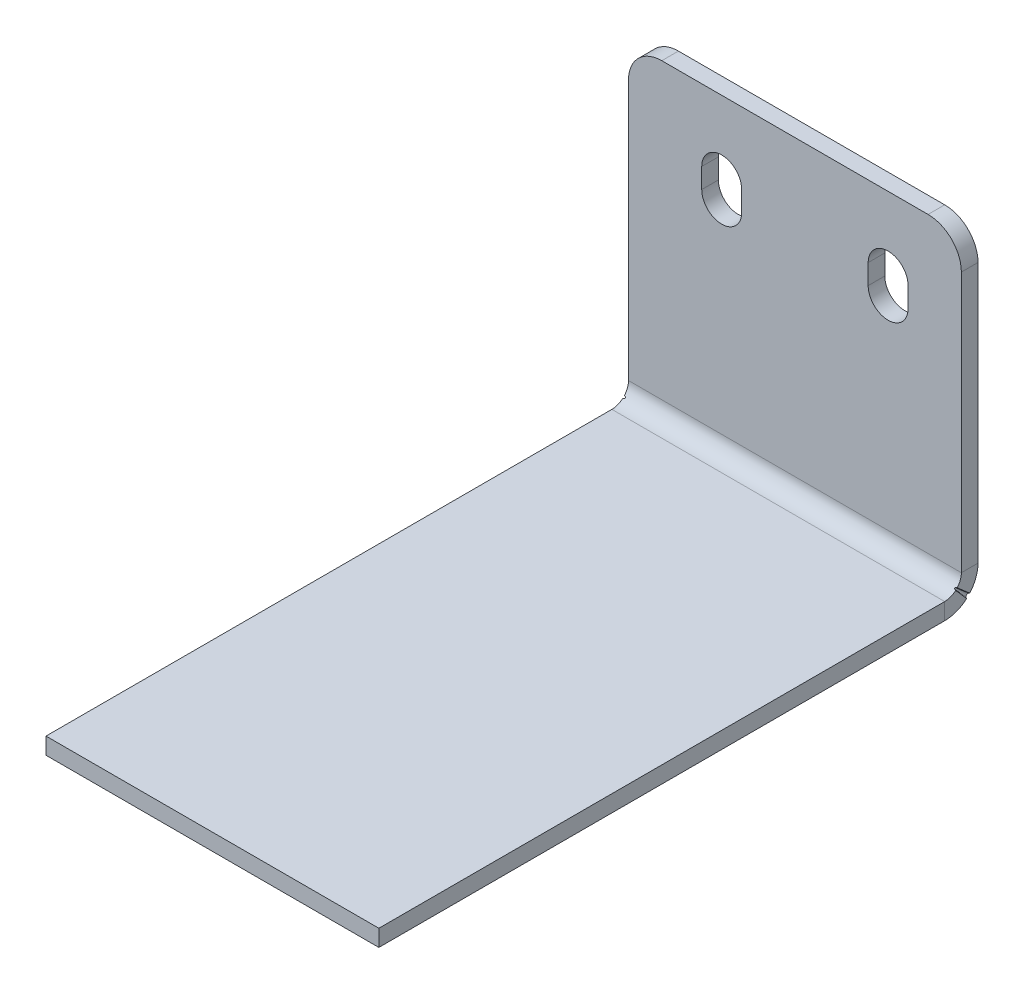
ISO-10303-21;
HEADER;
FILE_DESCRIPTION(('STEP AP214'),'2;1');
FILE_NAME('part.step','',(''),(''),'','','');
FILE_SCHEMA(('AUTOMOTIVE_DESIGN { 1 0 10303 214 1 1 1 1 }'));
ENDSEC;
DATA;
#1=APPLICATION_CONTEXT('core data for automotive mechanical design processes');
#2=APPLICATION_PROTOCOL_DEFINITION('international standard','automotive_design',2000,#1);
#3=PRODUCT_CONTEXT('',#1,'mechanical');
#4=PRODUCT('Part','Part','',(#3));
#5=PRODUCT_RELATED_PRODUCT_CATEGORY('part','',(#4));
#6=PRODUCT_DEFINITION_FORMATION('','',#4);
#7=PRODUCT_DEFINITION_CONTEXT('part definition',#1,'design');
#8=PRODUCT_DEFINITION('design','',#6,#7);
#9=PRODUCT_DEFINITION_SHAPE('','',#8);
#10=(LENGTH_UNIT() NAMED_UNIT(*) SI_UNIT(.MILLI.,.METRE.));
#11=(NAMED_UNIT(*) PLANE_ANGLE_UNIT() SI_UNIT($,.RADIAN.));
#12=(NAMED_UNIT(*) SI_UNIT($,.STERADIAN.) SOLID_ANGLE_UNIT());
#13=UNCERTAINTY_MEASURE_WITH_UNIT(LENGTH_MEASURE(1.E-05),#10,'distance_accuracy_value','');
#14=(GEOMETRIC_REPRESENTATION_CONTEXT(3) GLOBAL_UNCERTAINTY_ASSIGNED_CONTEXT((#13)) GLOBAL_UNIT_ASSIGNED_CONTEXT((#10,
#11,#12)) REPRESENTATION_CONTEXT('',''));
#15=CARTESIAN_POINT('',(0.,0.,0.));
#16=DIRECTION('',(0.,0.,1.));
#17=DIRECTION('',(1.,0.,0.));
#18=AXIS2_PLACEMENT_3D('',#15,#16,#17);
#19=CARTESIAN_POINT('',(50.,41.7804862254809,-0.890486225480803));
#20=DIRECTION('',(0.,1.,0.));
#21=DIRECTION('',(1.,0.,0.));
#22=AXIS2_PLACEMENT_3D('',#19,#20,#21);
#23=PLANE('',#22);
#24=DIRECTION('',(0.,0.,1.));
#25=VECTOR('',#24,1.);
#26=CARTESIAN_POINT('',(-50.,41.7804862254809,-0.390486225480803));
#27=LINE('',#26,#25);
#28=CARTESIAN_POINT('',(-50.,41.7804862254809,5.00000000000005));
#29=VERTEX_POINT('',#28);
#30=CARTESIAN_POINT('',(-50.,41.7804862254815,174.999513774519));
#31=VERTEX_POINT('',#30);
#32=EDGE_CURVE('E61',#29,#31,#27,.T.);
#33=ORIENTED_EDGE('',*,*,#32,.F.);
#34=DIRECTION('',(1.,0.,0.));
#35=VECTOR('',#34,1.);
#36=CARTESIAN_POINT('',(50.,41.7804862254809,5.00000000000004));
#37=LINE('',#36,#35);
#38=CARTESIAN_POINT('',(50.,41.7804862254809,5.00000000000005));
#39=VERTEX_POINT('',#38);
#40=EDGE_CURVE('E101',#29,#39,#37,.T.);
#41=ORIENTED_EDGE('',*,*,#40,.T.);
#42=DIRECTION('',(0.,0.,-1.));
#43=VECTOR('',#42,1.);
#44=CARTESIAN_POINT('',(50.,41.7804862254809,-0.390486225480803));
#45=LINE('',#44,#43);
#46=CARTESIAN_POINT('',(50.0000000000001,41.7804862254815,174.999513774519));
#47=VERTEX_POINT('',#46);
#48=EDGE_CURVE('E121',#47,#39,#45,.T.);
#49=ORIENTED_EDGE('',*,*,#48,.F.);
#50=DIRECTION('',(1.,0.,0.));
#51=VECTOR('',#50,1.);
#52=CARTESIAN_POINT('',(50.0000000000001,41.7804862254815,174.999513774519));
#53=LINE('',#52,#51);
#54=EDGE_CURVE('E100',#31,#47,#53,.T.);
#55=ORIENTED_EDGE('',*,*,#54,.F.);
#56=EDGE_LOOP('',(#33,#41,#49,#55));
#57=FACE_BOUND('',#56,.T.);
#58=ADVANCED_FACE('F57',(#57),#23,.F.);
#59=CARTESIAN_POINT('',(-50.,41.7804862254809,-0.390486225480803));
#60=DIRECTION('',(-1.,0.,0.));
#61=DIRECTION('',(0.,0.,1.));
#62=AXIS2_PLACEMENT_3D('',#59,#60,#61);
#63=PLANE('',#62);
#64=DIRECTION('',(0.,1.,0.));
#65=VECTOR('',#64,1.);
#66=CARTESIAN_POINT('',(-50.,41.7804862254808,5.00000000000004));
#67=LINE('',#66,#65);
#68=CARTESIAN_POINT('',(-49.9999999999999,46.7804862254809,5.00000000000003));
#69=VERTEX_POINT('',#68);
#70=EDGE_CURVE('E124',#29,#69,#67,.T.);
#71=ORIENTED_EDGE('',*,*,#70,.F.);
#72=ORIENTED_EDGE('',*,*,#32,.T.);
#73=DIRECTION('',(0.,1.,0.));
#74=VECTOR('',#73,1.);
#75=CARTESIAN_POINT('',(-50.,41.7804862254815,174.999513774519));
#76=LINE('',#75,#74);
#77=CARTESIAN_POINT('',(-50.,46.7804862254815,174.999513774519));
#78=VERTEX_POINT('',#77);
#79=EDGE_CURVE('E102',#31,#78,#76,.T.);
#80=ORIENTED_EDGE('',*,*,#79,.T.);
#81=DIRECTION('',(0.,0.,1.));
#82=VECTOR('',#81,1.);
#83=CARTESIAN_POINT('',(-50.,46.7804862254809,-0.390486225480824));
#84=LINE('',#83,#82);
#85=EDGE_CURVE('E113',#69,#78,#84,.T.);
#86=ORIENTED_EDGE('',*,*,#85,.F.);
#87=EDGE_LOOP('',(#71,#72,#80,#86));
#88=FACE_BOUND('',#87,.T.);
#89=ADVANCED_FACE('F132',(#88),#63,.T.);
#90=CARTESIAN_POINT('',(50.,41.7804862254809,-0.390486225480803));
#91=DIRECTION('',(1.,0.,0.));
#92=DIRECTION('',(0.,0.,-1.));
#93=AXIS2_PLACEMENT_3D('',#90,#91,#92);
#94=PLANE('',#93);
#95=DIRECTION('',(0.,-1.,0.));
#96=VECTOR('',#95,1.);
#97=CARTESIAN_POINT('',(50.,41.7804862254809,5.00000000000004));
#98=LINE('',#97,#96);
#99=CARTESIAN_POINT('',(50.0000000000001,46.7804862254809,5.00000000000003));
#100=VERTEX_POINT('',#99);
#101=EDGE_CURVE('E12',#100,#39,#98,.T.);
#102=ORIENTED_EDGE('',*,*,#101,.F.);
#103=DIRECTION('',(0.,0.,-1.));
#104=VECTOR('',#103,1.);
#105=CARTESIAN_POINT('',(50.,46.7804862254809,-0.390486225480824));
#106=LINE('',#105,#104);
#107=CARTESIAN_POINT('',(50.0000000000001,46.7804862254815,174.999513774519));
#108=VERTEX_POINT('',#107);
#109=EDGE_CURVE('E106',#108,#100,#106,.T.);
#110=ORIENTED_EDGE('',*,*,#109,.F.);
#111=DIRECTION('',(0.,1.,0.));
#112=VECTOR('',#111,1.);
#113=CARTESIAN_POINT('',(50.0000000000001,41.7804862254815,174.999513774519));
#114=LINE('',#113,#112);
#115=EDGE_CURVE('E82',#47,#108,#114,.T.);
#116=ORIENTED_EDGE('',*,*,#115,.F.);
#117=ORIENTED_EDGE('',*,*,#48,.T.);
#118=EDGE_LOOP('',(#102,#110,#116,#117));
#119=FACE_BOUND('',#118,.T.);
#120=ADVANCED_FACE('F59',(#119),#94,.T.);
#121=CARTESIAN_POINT('',(50.0000000000001,41.7804862254815,174.999513774519));
#122=DIRECTION('',(0.,0.,1.));
#123=DIRECTION('',(0.,-1.,0.));
#124=AXIS2_PLACEMENT_3D('',#121,#122,#123);
#125=PLANE('',#124);
#126=DIRECTION('',(1.,0.,0.));
#127=VECTOR('',#126,1.);
#128=CARTESIAN_POINT('',(50.0000000000001,46.7804862254815,174.999513774519));
#129=LINE('',#128,#127);
#130=EDGE_CURVE('E98',#78,#108,#129,.T.);
#131=ORIENTED_EDGE('',*,*,#130,.F.);
#132=ORIENTED_EDGE('',*,*,#79,.F.);
#133=ORIENTED_EDGE('',*,*,#54,.T.);
#134=ORIENTED_EDGE('',*,*,#115,.T.);
#135=EDGE_LOOP('',(#131,#132,#133,#134));
#136=FACE_BOUND('',#135,.T.);
#137=ADVANCED_FACE('F95',(#136),#125,.T.);
#138=CARTESIAN_POINT('',(50.,46.7804862254809,-0.890486225480824));
#139=DIRECTION('',(0.,1.,0.));
#140=DIRECTION('',(1.,0.,0.));
#141=AXIS2_PLACEMENT_3D('',#138,#139,#140);
#142=PLANE('',#141);
#143=DIRECTION('',(1.,0.,0.));
#144=VECTOR('',#143,1.);
#145=CARTESIAN_POINT('',(50.,46.7804862254809,5.00000000000005));
#146=LINE('',#145,#144);
#147=EDGE_CURVE('E66',#69,#100,#146,.T.);
#148=ORIENTED_EDGE('',*,*,#147,.F.);
#149=ORIENTED_EDGE('',*,*,#85,.T.);
#150=ORIENTED_EDGE('',*,*,#130,.T.);
#151=ORIENTED_EDGE('',*,*,#109,.T.);
#152=EDGE_LOOP('',(#148,#149,#150,#151));
#153=FACE_BOUND('',#152,.T.);
#154=ADVANCED_FACE('F111',(#153),#142,.T.);
#155=CARTESIAN_POINT('',(28.,112.472965932998,-5.));
#156=DIRECTION('',(0.,0.,1.));
#157=DIRECTION('',(1.,0.,0.));
#158=AXIS2_PLACEMENT_3D('',#155,#156,#157);
#159=CYLINDRICAL_SURFACE('',#158,6.);
#160=CARTESIAN_POINT('',(28.,112.472965932998,0.));
#161=DIRECTION('',(0.,0.,1.));
#162=DIRECTION('',(1.,0.,0.));
#163=AXIS2_PLACEMENT_3D('',#160,#161,#162);
#164=CIRCLE('',#163,6.);
#165=CARTESIAN_POINT('',(22.,112.472965932998,0.));
#166=VERTEX_POINT('',#165);
#167=CARTESIAN_POINT('',(34.,112.472965932998,0.));
#168=VERTEX_POINT('',#167);
#169=EDGE_CURVE('E514',#166,#168,#164,.T.);
#170=ORIENTED_EDGE('',*,*,#169,.T.);
#171=DIRECTION('',(0.,0.,1.));
#172=VECTOR('',#171,1.);
#173=CARTESIAN_POINT('',(34.,112.472965932998,-5.));
#174=LINE('',#173,#172);
#175=CARTESIAN_POINT('',(34.,112.472965932998,-5.));
#176=VERTEX_POINT('',#175);
#177=EDGE_CURVE('E493',#176,#168,#174,.T.);
#178=ORIENTED_EDGE('',*,*,#177,.F.);
#179=CARTESIAN_POINT('',(28.,112.472965932998,-5.));
#180=DIRECTION('',(0.,0.,1.));
#181=DIRECTION('',(1.,0.,0.));
#182=AXIS2_PLACEMENT_3D('',#179,#180,#181);
#183=CIRCLE('',#182,6.);
#184=CARTESIAN_POINT('',(22.,112.472965932998,-5.));
#185=VERTEX_POINT('',#184);
#186=EDGE_CURVE('E429',#185,#176,#183,.T.);
#187=ORIENTED_EDGE('',*,*,#186,.F.);
#188=DIRECTION('',(0.,0.,1.));
#189=VECTOR('',#188,1.);
#190=CARTESIAN_POINT('',(22.,112.472965932998,-5.));
#191=LINE('',#190,#189);
#192=EDGE_CURVE('E511',#185,#166,#191,.T.);
#193=ORIENTED_EDGE('',*,*,#192,.T.);
#194=EDGE_LOOP('',(#170,#178,#187,#193));
#195=FACE_BOUND('',#194,.T.);
#196=ADVANCED_FACE('F323',(#195),#159,.F.);
#197=CARTESIAN_POINT('',(22.,118.472965932998,-5.));
#198=DIRECTION('',(-1.,0.,0.));
#199=DIRECTION('',(0.,0.,1.));
#200=AXIS2_PLACEMENT_3D('',#197,#198,#199);
#201=PLANE('',#200);
#202=DIRECTION('',(0.,-1.,0.));
#203=VECTOR('',#202,1.);
#204=CARTESIAN_POINT('',(22.,118.472965932998,0.));
#205=LINE('',#204,#203);
#206=CARTESIAN_POINT('',(22.,118.472965932998,0.));
#207=VERTEX_POINT('',#206);
#208=EDGE_CURVE('E508',#207,#166,#205,.T.);
#209=ORIENTED_EDGE('',*,*,#208,.T.);
#210=ORIENTED_EDGE('',*,*,#192,.F.);
#211=DIRECTION('',(0.,-1.,0.));
#212=VECTOR('',#211,1.);
#213=CARTESIAN_POINT('',(22.,118.472965932998,-5.));
#214=LINE('',#213,#212);
#215=CARTESIAN_POINT('',(22.,118.472965932998,-5.));
#216=VERTEX_POINT('',#215);
#217=EDGE_CURVE('E432',#216,#185,#214,.T.);
#218=ORIENTED_EDGE('',*,*,#217,.F.);
#219=DIRECTION('',(0.,0.,1.));
#220=VECTOR('',#219,1.);
#221=CARTESIAN_POINT('',(22.,118.472965932998,-5.));
#222=LINE('',#221,#220);
#223=EDGE_CURVE('E505',#216,#207,#222,.T.);
#224=ORIENTED_EDGE('',*,*,#223,.T.);
#225=EDGE_LOOP('',(#209,#210,#218,#224));
#226=FACE_BOUND('',#225,.T.);
#227=ADVANCED_FACE('F649',(#226),#201,.F.);
#228=CARTESIAN_POINT('',(28.,118.472965932998,-5.));
#229=DIRECTION('',(0.,0.,1.));
#230=DIRECTION('',(1.,0.,0.));
#231=AXIS2_PLACEMENT_3D('',#228,#229,#230);
#232=CYLINDRICAL_SURFACE('',#231,6.);
#233=CARTESIAN_POINT('',(28.,118.472965932998,0.));
#234=DIRECTION('',(0.,0.,1.));
#235=DIRECTION('',(1.,0.,0.));
#236=AXIS2_PLACEMENT_3D('',#233,#234,#235);
#237=CIRCLE('',#236,6.);
#238=CARTESIAN_POINT('',(34.,118.472965932998,0.));
#239=VERTEX_POINT('',#238);
#240=EDGE_CURVE('E502',#239,#207,#237,.T.);
#241=ORIENTED_EDGE('',*,*,#240,.T.);
#242=ORIENTED_EDGE('',*,*,#223,.F.);
#243=CARTESIAN_POINT('',(28.,118.472965932998,-5.));
#244=DIRECTION('',(0.,0.,1.));
#245=DIRECTION('',(1.,0.,0.));
#246=AXIS2_PLACEMENT_3D('',#243,#244,#245);
#247=CIRCLE('',#246,6.);
#248=CARTESIAN_POINT('',(34.,118.472965932998,-5.));
#249=VERTEX_POINT('',#248);
#250=EDGE_CURVE('E435',#249,#216,#247,.T.);
#251=ORIENTED_EDGE('',*,*,#250,.F.);
#252=DIRECTION('',(0.,0.,1.));
#253=VECTOR('',#252,1.);
#254=CARTESIAN_POINT('',(34.,118.472965932998,-5.));
#255=LINE('',#254,#253);
#256=EDGE_CURVE('E499',#249,#239,#255,.T.);
#257=ORIENTED_EDGE('',*,*,#256,.T.);
#258=EDGE_LOOP('',(#241,#242,#251,#257));
#259=FACE_BOUND('',#258,.T.);
#260=ADVANCED_FACE('F686',(#259),#232,.F.);
#261=CARTESIAN_POINT('',(34.,118.472965932998,-5.));
#262=DIRECTION('',(1.,0.,0.));
#263=DIRECTION('',(0.,0.,-1.));
#264=AXIS2_PLACEMENT_3D('',#261,#262,#263);
#265=PLANE('',#264);
#266=DIRECTION('',(0.,1.,0.));
#267=VECTOR('',#266,1.);
#268=CARTESIAN_POINT('',(34.,118.472965932998,0.));
#269=LINE('',#268,#267);
#270=EDGE_CURVE('E496',#168,#239,#269,.T.);
#271=ORIENTED_EDGE('',*,*,#270,.T.);
#272=ORIENTED_EDGE('',*,*,#256,.F.);
#273=DIRECTION('',(0.,1.,0.));
#274=VECTOR('',#273,1.);
#275=CARTESIAN_POINT('',(34.,118.472965932998,-5.));
#276=LINE('',#275,#274);
#277=EDGE_CURVE('E438',#176,#249,#276,.T.);
#278=ORIENTED_EDGE('',*,*,#277,.F.);
#279=ORIENTED_EDGE('',*,*,#177,.T.);
#280=EDGE_LOOP('',(#271,#272,#278,#279));
#281=FACE_BOUND('',#280,.T.);
#282=ADVANCED_FACE('F695',(#281),#265,.F.);
#283=CARTESIAN_POINT('',(-22.,112.472965932998,-5.));
#284=DIRECTION('',(0.,0.,1.));
#285=DIRECTION('',(1.,0.,0.));
#286=AXIS2_PLACEMENT_3D('',#283,#284,#285);
#287=CYLINDRICAL_SURFACE('',#286,6.);
#288=CARTESIAN_POINT('',(-22.,112.472965932998,0.));
#289=DIRECTION('',(0.,0.,1.));
#290=DIRECTION('',(1.,0.,0.));
#291=AXIS2_PLACEMENT_3D('',#288,#289,#290);
#292=CIRCLE('',#291,6.);
#293=CARTESIAN_POINT('',(-28.,112.472965932998,0.));
#294=VERTEX_POINT('',#293);
#295=CARTESIAN_POINT('',(-16.,112.472965932998,0.));
#296=VERTEX_POINT('',#295);
#297=EDGE_CURVE('E490',#294,#296,#292,.T.);
#298=ORIENTED_EDGE('',*,*,#297,.T.);
#299=DIRECTION('',(0.,0.,1.));
#300=VECTOR('',#299,1.);
#301=CARTESIAN_POINT('',(-16.,112.472965932998,-5.));
#302=LINE('',#301,#300);
#303=CARTESIAN_POINT('',(-16.,112.472965932998,-5.));
#304=VERTEX_POINT('',#303);
#305=EDGE_CURVE('E469',#304,#296,#302,.T.);
#306=ORIENTED_EDGE('',*,*,#305,.F.);
#307=CARTESIAN_POINT('',(-22.,112.472965932998,-5.));
#308=DIRECTION('',(0.,0.,1.));
#309=DIRECTION('',(1.,0.,0.));
#310=AXIS2_PLACEMENT_3D('',#307,#308,#309);
#311=CIRCLE('',#310,6.);
#312=CARTESIAN_POINT('',(-28.,112.472965932998,-5.));
#313=VERTEX_POINT('',#312);
#314=EDGE_CURVE('E441',#313,#304,#311,.T.);
#315=ORIENTED_EDGE('',*,*,#314,.F.);
#316=DIRECTION('',(0.,0.,1.));
#317=VECTOR('',#316,1.);
#318=CARTESIAN_POINT('',(-28.,112.472965932998,-5.));
#319=LINE('',#318,#317);
#320=EDGE_CURVE('E487',#313,#294,#319,.T.);
#321=ORIENTED_EDGE('',*,*,#320,.T.);
#322=EDGE_LOOP('',(#298,#306,#315,#321));
#323=FACE_BOUND('',#322,.T.);
#324=ADVANCED_FACE('F705',(#323),#287,.F.);
#325=CARTESIAN_POINT('',(-28.,118.472965932998,-5.));
#326=DIRECTION('',(-1.,0.,0.));
#327=DIRECTION('',(0.,0.,1.));
#328=AXIS2_PLACEMENT_3D('',#325,#326,#327);
#329=PLANE('',#328);
#330=DIRECTION('',(0.,-1.,0.));
#331=VECTOR('',#330,1.);
#332=CARTESIAN_POINT('',(-28.,118.472965932998,0.));
#333=LINE('',#332,#331);
#334=CARTESIAN_POINT('',(-28.,118.472965932998,0.));
#335=VERTEX_POINT('',#334);
#336=EDGE_CURVE('E484',#335,#294,#333,.T.);
#337=ORIENTED_EDGE('',*,*,#336,.T.);
#338=ORIENTED_EDGE('',*,*,#320,.F.);
#339=DIRECTION('',(0.,-1.,0.));
#340=VECTOR('',#339,1.);
#341=CARTESIAN_POINT('',(-28.,118.472965932998,-5.));
#342=LINE('',#341,#340);
#343=CARTESIAN_POINT('',(-28.,118.472965932998,-5.));
#344=VERTEX_POINT('',#343);
#345=EDGE_CURVE('E444',#344,#313,#342,.T.);
#346=ORIENTED_EDGE('',*,*,#345,.F.);
#347=DIRECTION('',(0.,0.,1.));
#348=VECTOR('',#347,1.);
#349=CARTESIAN_POINT('',(-28.,118.472965932998,-5.));
#350=LINE('',#349,#348);
#351=EDGE_CURVE('E481',#344,#335,#350,.T.);
#352=ORIENTED_EDGE('',*,*,#351,.T.);
#353=EDGE_LOOP('',(#337,#338,#346,#352));
#354=FACE_BOUND('',#353,.T.);
#355=ADVANCED_FACE('F715',(#354),#329,.F.);
#356=CARTESIAN_POINT('',(-22.,118.472965932998,-5.));
#357=DIRECTION('',(0.,0.,1.));
#358=DIRECTION('',(1.,0.,0.));
#359=AXIS2_PLACEMENT_3D('',#356,#357,#358);
#360=CYLINDRICAL_SURFACE('',#359,6.);
#361=CARTESIAN_POINT('',(-22.,118.472965932998,0.));
#362=DIRECTION('',(0.,0.,1.));
#363=DIRECTION('',(1.,0.,0.));
#364=AXIS2_PLACEMENT_3D('',#361,#362,#363);
#365=CIRCLE('',#364,6.);
#366=CARTESIAN_POINT('',(-16.,118.472965932998,0.));
#367=VERTEX_POINT('',#366);
#368=EDGE_CURVE('E478',#367,#335,#365,.T.);
#369=ORIENTED_EDGE('',*,*,#368,.T.);
#370=ORIENTED_EDGE('',*,*,#351,.F.);
#371=CARTESIAN_POINT('',(-22.,118.472965932998,-5.));
#372=DIRECTION('',(0.,0.,1.));
#373=DIRECTION('',(1.,0.,0.));
#374=AXIS2_PLACEMENT_3D('',#371,#372,#373);
#375=CIRCLE('',#374,6.);
#376=CARTESIAN_POINT('',(-16.,118.472965932998,-5.));
#377=VERTEX_POINT('',#376);
#378=EDGE_CURVE('E447',#377,#344,#375,.T.);
#379=ORIENTED_EDGE('',*,*,#378,.F.);
#380=DIRECTION('',(0.,0.,1.));
#381=VECTOR('',#380,1.);
#382=CARTESIAN_POINT('',(-16.,118.472965932998,-5.));
#383=LINE('',#382,#381);
#384=EDGE_CURVE('E475',#377,#367,#383,.T.);
#385=ORIENTED_EDGE('',*,*,#384,.T.);
#386=EDGE_LOOP('',(#369,#370,#379,#385));
#387=FACE_BOUND('',#386,.T.);
#388=ADVANCED_FACE('F633',(#387),#360,.F.);
#389=CARTESIAN_POINT('',(-16.,118.472965932998,-5.));
#390=DIRECTION('',(1.,0.,0.));
#391=DIRECTION('',(0.,1.,0.));
#392=AXIS2_PLACEMENT_3D('',#389,#390,#391);
#393=PLANE('',#392);
#394=DIRECTION('',(0.,1.,0.));
#395=VECTOR('',#394,1.);
#396=CARTESIAN_POINT('',(-16.,118.472965932998,0.));
#397=LINE('',#396,#395);
#398=EDGE_CURVE('E472',#296,#367,#397,.T.);
#399=ORIENTED_EDGE('',*,*,#398,.T.);
#400=ORIENTED_EDGE('',*,*,#384,.F.);
#401=DIRECTION('',(0.,1.,0.));
#402=VECTOR('',#401,1.);
#403=CARTESIAN_POINT('',(-16.,118.472965932998,-5.));
#404=LINE('',#403,#402);
#405=EDGE_CURVE('E450',#304,#377,#404,.T.);
#406=ORIENTED_EDGE('',*,*,#405,.F.);
#407=ORIENTED_EDGE('',*,*,#305,.T.);
#408=EDGE_LOOP('',(#399,#400,#406,#407));
#409=FACE_BOUND('',#408,.T.);
#410=ADVANCED_FACE('F626',(#409),#393,.F.);
#411=CARTESIAN_POINT('',(40.,130.,-5.));
#412=DIRECTION('',(0.,0.,1.));
#413=DIRECTION('',(1.,0.,0.));
#414=AXIS2_PLACEMENT_3D('',#411,#412,#413);
#415=CYLINDRICAL_SURFACE('',#414,10.);
#416=CARTESIAN_POINT('',(40.,130.,0.));
#417=DIRECTION('',(0.,0.,1.));
#418=DIRECTION('',(-1.,0.,0.));
#419=AXIS2_PLACEMENT_3D('',#416,#417,#418);
#420=CIRCLE('',#419,10.);
#421=CARTESIAN_POINT('',(50.,130.,0.));
#422=VERTEX_POINT('',#421);
#423=CARTESIAN_POINT('',(40.,140.,0.));
#424=VERTEX_POINT('',#423);
#425=EDGE_CURVE('E415',#422,#424,#420,.T.);
#426=ORIENTED_EDGE('',*,*,#425,.F.);
#427=DIRECTION('',(0.,0.,1.));
#428=VECTOR('',#427,1.);
#429=CARTESIAN_POINT('',(50.,130.,-5.));
#430=LINE('',#429,#428);
#431=CARTESIAN_POINT('',(50.,130.,-5.));
#432=VERTEX_POINT('',#431);
#433=EDGE_CURVE('E116',#432,#422,#430,.T.);
#434=ORIENTED_EDGE('',*,*,#433,.F.);
#435=CARTESIAN_POINT('',(40.,130.,-5.));
#436=DIRECTION('',(0.,0.,1.));
#437=DIRECTION('',(-1.,0.,0.));
#438=AXIS2_PLACEMENT_3D('',#435,#436,#437);
#439=CIRCLE('',#438,10.);
#440=CARTESIAN_POINT('',(40.,140.,-5.));
#441=VERTEX_POINT('',#440);
#442=EDGE_CURVE('E396',#432,#441,#439,.T.);
#443=ORIENTED_EDGE('',*,*,#442,.T.);
#444=DIRECTION('',(0.,0.,1.));
#445=VECTOR('',#444,1.);
#446=CARTESIAN_POINT('',(40.,140.,-5.));
#447=LINE('',#446,#445);
#448=EDGE_CURVE('E465',#441,#424,#447,.T.);
#449=ORIENTED_EDGE('',*,*,#448,.T.);
#450=EDGE_LOOP('',(#426,#434,#443,#449));
#451=FACE_BOUND('',#450,.T.);
#452=ADVANCED_FACE('F602',(#451),#415,.T.);
#453=CARTESIAN_POINT('',(-40.,140.,-5.));
#454=DIRECTION('',(0.,1.,0.));
#455=DIRECTION('',(0.,0.,1.));
#456=AXIS2_PLACEMENT_3D('',#453,#454,#455);
#457=PLANE('',#456);
#458=DIRECTION('',(-1.,0.,0.));
#459=VECTOR('',#458,1.);
#460=CARTESIAN_POINT('',(-40.,140.,0.));
#461=LINE('',#460,#459);
#462=CARTESIAN_POINT('',(-40.,140.,0.));
#463=VERTEX_POINT('',#462);
#464=EDGE_CURVE('E409',#424,#463,#461,.T.);
#465=ORIENTED_EDGE('',*,*,#464,.F.);
#466=ORIENTED_EDGE('',*,*,#448,.F.);
#467=DIRECTION('',(-1.,0.,0.));
#468=VECTOR('',#467,1.);
#469=CARTESIAN_POINT('',(-40.,140.,-5.));
#470=LINE('',#469,#468);
#471=CARTESIAN_POINT('',(-40.,140.,-5.));
#472=VERTEX_POINT('',#471);
#473=EDGE_CURVE('E462',#441,#472,#470,.T.);
#474=ORIENTED_EDGE('',*,*,#473,.T.);
#475=DIRECTION('',(0.,0.,1.));
#476=VECTOR('',#475,1.);
#477=CARTESIAN_POINT('',(-40.,140.,-5.));
#478=LINE('',#477,#476);
#479=EDGE_CURVE('E459',#472,#463,#478,.T.);
#480=ORIENTED_EDGE('',*,*,#479,.T.);
#481=EDGE_LOOP('',(#465,#466,#474,#480));
#482=FACE_BOUND('',#481,.T.);
#483=ADVANCED_FACE('F599',(#482),#457,.T.);
#484=CARTESIAN_POINT('',(-40.,130.,-5.));
#485=DIRECTION('',(0.,0.,1.));
#486=DIRECTION('',(1.,0.,0.));
#487=AXIS2_PLACEMENT_3D('',#484,#485,#486);
#488=CYLINDRICAL_SURFACE('',#487,10.);
#489=CARTESIAN_POINT('',(-40.,130.,0.));
#490=DIRECTION('',(0.,0.,1.));
#491=DIRECTION('',(-1.,0.,0.));
#492=AXIS2_PLACEMENT_3D('',#489,#490,#491);
#493=CIRCLE('',#492,10.);
#494=CARTESIAN_POINT('',(-50.,130.,0.));
#495=VERTEX_POINT('',#494);
#496=EDGE_CURVE('E406',#463,#495,#493,.T.);
#497=ORIENTED_EDGE('',*,*,#496,.F.);
#498=ORIENTED_EDGE('',*,*,#479,.F.);
#499=CARTESIAN_POINT('',(-40.,130.,-5.));
#500=DIRECTION('',(0.,0.,1.));
#501=DIRECTION('',(-1.,0.,0.));
#502=AXIS2_PLACEMENT_3D('',#499,#500,#501);
#503=CIRCLE('',#502,10.);
#504=CARTESIAN_POINT('',(-50.,130.,-5.));
#505=VERTEX_POINT('',#504);
#506=EDGE_CURVE('E456',#472,#505,#503,.T.);
#507=ORIENTED_EDGE('',*,*,#506,.T.);
#508=DIRECTION('',(0.,0.,1.));
#509=VECTOR('',#508,1.);
#510=CARTESIAN_POINT('',(-50.,130.,-5.));
#511=LINE('',#510,#509);
#512=EDGE_CURVE('E453',#505,#495,#511,.T.);
#513=ORIENTED_EDGE('',*,*,#512,.T.);
#514=EDGE_LOOP('',(#497,#498,#507,#513));
#515=FACE_BOUND('',#514,.T.);
#516=ADVANCED_FACE('F596',(#515),#488,.T.);
#517=CARTESIAN_POINT('',(50.,45.89,-5.));
#518=DIRECTION('',(0.,0.,1.));
#519=DIRECTION('',(1.,0.,0.));
#520=AXIS2_PLACEMENT_3D('',#517,#518,#519);
#521=PLANE('',#520);
#522=DIRECTION('',(1.,0.,0.));
#523=VECTOR('',#522,1.);
#524=CARTESIAN_POINT('',(50.,51.7804862254809,-5.));
#525=LINE('',#524,#523);
#526=CARTESIAN_POINT('',(-50.,51.7804862254809,-5.));
#527=VERTEX_POINT('',#526);
#528=CARTESIAN_POINT('',(50.0000000000001,51.7804862254809,-5.));
#529=VERTEX_POINT('',#528);
#530=EDGE_CURVE('E377',#527,#529,#525,.T.);
#531=ORIENTED_EDGE('',*,*,#530,.F.);
#532=DIRECTION('',(0.,-1.,0.));
#533=VECTOR('',#532,1.);
#534=CARTESIAN_POINT('',(-50.,130.,-5.));
#535=LINE('',#534,#533);
#536=EDGE_CURVE('E427',#505,#527,#535,.T.);
#537=ORIENTED_EDGE('',*,*,#536,.F.);
#538=ORIENTED_EDGE('',*,*,#506,.F.);
#539=ORIENTED_EDGE('',*,*,#473,.F.);
#540=ORIENTED_EDGE('',*,*,#442,.F.);
#541=DIRECTION('',(0.,1.,0.));
#542=VECTOR('',#541,1.);
#543=CARTESIAN_POINT('',(50.,130.,-5.));
#544=LINE('',#543,#542);
#545=EDGE_CURVE('E389',#529,#432,#544,.T.);
#546=ORIENTED_EDGE('',*,*,#545,.F.);
#547=EDGE_LOOP('',(#531,#537,#538,#539,#540,#546));
#548=FACE_BOUND('',#547,.T.);
#549=ORIENTED_EDGE('',*,*,#405,.T.);
#550=ORIENTED_EDGE('',*,*,#378,.T.);
#551=ORIENTED_EDGE('',*,*,#345,.T.);
#552=ORIENTED_EDGE('',*,*,#314,.T.);
#553=EDGE_LOOP('',(#549,#550,#551,#552));
#554=FACE_BOUND('',#553,.T.);
#555=ORIENTED_EDGE('',*,*,#277,.T.);
#556=ORIENTED_EDGE('',*,*,#250,.T.);
#557=ORIENTED_EDGE('',*,*,#217,.T.);
#558=ORIENTED_EDGE('',*,*,#186,.T.);
#559=EDGE_LOOP('',(#555,#556,#557,#558));
#560=FACE_BOUND('',#559,.T.);
#561=ADVANCED_FACE('F390',(#548,#554,#560),#521,.F.);
#562=CARTESIAN_POINT('',(-50.,130.,-5.));
#563=DIRECTION('',(-1.,0.,0.));
#564=DIRECTION('',(0.,-1.,0.));
#565=AXIS2_PLACEMENT_3D('',#562,#563,#564);
#566=PLANE('',#565);
#567=ORIENTED_EDGE('',*,*,#536,.T.);
#568=DIRECTION('',(0.,0.,1.));
#569=VECTOR('',#568,1.);
#570=CARTESIAN_POINT('',(-50.,51.7804862254809,-5.00000000000055));
#571=LINE('',#570,#569);
#572=CARTESIAN_POINT('',(-50.,51.7804862254809,0.));
#573=VERTEX_POINT('',#572);
#574=EDGE_CURVE('E424',#527,#573,#571,.T.);
#575=ORIENTED_EDGE('',*,*,#574,.T.);
#576=DIRECTION('',(0.,-1.,0.));
#577=VECTOR('',#576,1.);
#578=CARTESIAN_POINT('',(-50.,130.,0.));
#579=LINE('',#578,#577);
#580=EDGE_CURVE('E421',#495,#573,#579,.T.);
#581=ORIENTED_EDGE('',*,*,#580,.F.);
#582=ORIENTED_EDGE('',*,*,#512,.F.);
#583=EDGE_LOOP('',(#567,#575,#581,#582));
#584=FACE_BOUND('',#583,.T.);
#585=ADVANCED_FACE('F592',(#584),#566,.T.);
#586=CARTESIAN_POINT('',(50.,45.89,0.));
#587=DIRECTION('',(0.,0.,1.));
#588=DIRECTION('',(1.,0.,0.));
#589=AXIS2_PLACEMENT_3D('',#586,#587,#588);
#590=PLANE('',#589);
#591=ORIENTED_EDGE('',*,*,#368,.F.);
#592=ORIENTED_EDGE('',*,*,#398,.F.);
#593=ORIENTED_EDGE('',*,*,#297,.F.);
#594=ORIENTED_EDGE('',*,*,#336,.F.);
#595=EDGE_LOOP('',(#591,#592,#593,#594));
#596=FACE_BOUND('',#595,.T.);
#597=ORIENTED_EDGE('',*,*,#240,.F.);
#598=ORIENTED_EDGE('',*,*,#270,.F.);
#599=ORIENTED_EDGE('',*,*,#169,.F.);
#600=ORIENTED_EDGE('',*,*,#208,.F.);
#601=EDGE_LOOP('',(#597,#598,#599,#600));
#602=FACE_BOUND('',#601,.T.);
#603=ORIENTED_EDGE('',*,*,#580,.T.);
#604=DIRECTION('',(1.,0.,0.));
#605=VECTOR('',#604,1.);
#606=CARTESIAN_POINT('',(50.,51.7804862254809,0.));
#607=LINE('',#606,#605);
#608=CARTESIAN_POINT('',(50.0000000000001,51.7804862254809,0.));
#609=VERTEX_POINT('',#608);
#610=EDGE_CURVE('E419',#573,#609,#607,.T.);
#611=ORIENTED_EDGE('',*,*,#610,.T.);
#612=DIRECTION('',(0.,1.,0.));
#613=VECTOR('',#612,1.);
#614=CARTESIAN_POINT('',(50.,130.,0.));
#615=LINE('',#614,#613);
#616=EDGE_CURVE('E404',#609,#422,#615,.T.);
#617=ORIENTED_EDGE('',*,*,#616,.T.);
#618=ORIENTED_EDGE('',*,*,#425,.T.);
#619=ORIENTED_EDGE('',*,*,#464,.T.);
#620=ORIENTED_EDGE('',*,*,#496,.T.);
#621=EDGE_LOOP('',(#603,#611,#617,#618,#619,#620));
#622=FACE_BOUND('',#621,.T.);
#623=ADVANCED_FACE('F589',(#596,#602,#622),#590,.T.);
#624=CARTESIAN_POINT('',(50.,130.,-5.));
#625=DIRECTION('',(1.,0.,0.));
#626=DIRECTION('',(0.,1.,0.));
#627=AXIS2_PLACEMENT_3D('',#624,#625,#626);
#628=PLANE('',#627);
#629=ORIENTED_EDGE('',*,*,#616,.F.);
#630=DIRECTION('',(0.,0.,-1.));
#631=VECTOR('',#630,1.);
#632=CARTESIAN_POINT('',(50.,51.7804862254809,-5.00000000000055));
#633=LINE('',#632,#631);
#634=EDGE_CURVE('E382',#609,#529,#633,.T.);
#635=ORIENTED_EDGE('',*,*,#634,.T.);
#636=ORIENTED_EDGE('',*,*,#545,.T.);
#637=ORIENTED_EDGE('',*,*,#433,.T.);
#638=EDGE_LOOP('',(#629,#635,#636,#637));
#639=FACE_BOUND('',#638,.T.);
#640=ADVANCED_FACE('F402',(#639),#628,.T.);
#641=CARTESIAN_POINT('',(-50.,51.7804862254809,5.));
#642=DIRECTION('',(-1.,0.,0.));
#643=DIRECTION('',(0.,0.,1.));
#644=AXIS2_PLACEMENT_3D('',#641,#642,#643);
#645=PLANE('',#644);
#646=CARTESIAN_POINT('',(-49.9999999999999,48.4883338570111,1.23679222168391));
#647=CARTESIAN_POINT('',(-49.9999999999999,45.1961814885413,-2.52641555663219));
#648=B_SPLINE_CURVE_WITH_KNOTS('',1,(#646,#647),.UNSPECIFIED.,.F.,.F.,(2,2),(0.,1.),.UNSPECIFIED.);
#649=CARTESIAN_POINT('',(-49.9999999999999,48.4883338570111,1.2367922216839));
#650=VERTEX_POINT('',#649);
#651=CARTESIAN_POINT('',(-50.,45.1961814885413,-2.52641555663219));
#652=VERTEX_POINT('',#651);
#653=EDGE_CURVE('E303',#650,#652,#648,.T.);
#654=ORIENTED_EDGE('',*,*,#653,.F.);
#655=CARTESIAN_POINT('',(-49.9999999999999,51.7804862254809,5.));
#656=DIRECTION('',(-1.,0.,0.));
#657=DIRECTION('',(0.,-1.,0.));
#658=AXIS2_PLACEMENT_3D('',#655,#656,#657);
#659=CIRCLE('',#658,5.);
#660=EDGE_CURVE('E206',#650,#573,#659,.F.);
#661=ORIENTED_EDGE('',*,*,#660,.T.);
#662=ORIENTED_EDGE('',*,*,#574,.F.);
#663=CARTESIAN_POINT('',(-50.,51.7804862254809,5.));
#664=DIRECTION('',(1.,0.,0.));
#665=DIRECTION('',(0.,0.,1.));
#666=AXIS2_PLACEMENT_3D('',#663,#664,#665);
#667=CIRCLE('',#666,10.);
#668=EDGE_CURVE('E350',#652,#527,#667,.T.);
#669=ORIENTED_EDGE('',*,*,#668,.F.);
#670=EDGE_LOOP('',(#654,#661,#662,#669));
#671=FACE_BOUND('',#670,.T.);
#672=ADVANCED_FACE('F321',(#671),#645,.T.);
#673=CARTESIAN_POINT('',(50.0000000000001,51.7804862254809,5.));
#674=DIRECTION('',(1.,0.,0.));
#675=DIRECTION('',(0.,0.,-1.));
#676=AXIS2_PLACEMENT_3D('',#673,#674,#675);
#677=PLANE('',#676);
#678=ORIENTED_EDGE('',*,*,#634,.F.);
#679=CARTESIAN_POINT('',(50.0000000000001,51.7804862254809,5.));
#680=DIRECTION('',(-1.,0.,0.));
#681=DIRECTION('',(0.,-1.,0.));
#682=AXIS2_PLACEMENT_3D('',#679,#680,#681);
#683=CIRCLE('',#682,5.);
#684=CARTESIAN_POINT('',(50.0000000000001,48.4883338570111,1.23679222168391));
#685=VERTEX_POINT('',#684);
#686=EDGE_CURVE('E197',#609,#685,#683,.T.);
#687=ORIENTED_EDGE('',*,*,#686,.T.);
#688=CARTESIAN_POINT('',(50.0000000000001,45.1961814885413,-2.52641555663219));
#689=CARTESIAN_POINT('',(50.0000000000001,48.4883338570111,1.23679222168391));
#690=B_SPLINE_CURVE_WITH_KNOTS('',1,(#688,#689),.UNSPECIFIED.,.F.,.F.,(2,2),(0.,1.),.UNSPECIFIED.);
#691=CARTESIAN_POINT('',(50.0000000000001,45.1961814885413,-2.52641555663219));
#692=VERTEX_POINT('',#691);
#693=EDGE_CURVE('E279',#685,#692,#690,.F.);
#694=ORIENTED_EDGE('',*,*,#693,.T.);
#695=CARTESIAN_POINT('',(50.0000000000001,51.7804862254809,5.));
#696=DIRECTION('',(-1.,0.,0.));
#697=DIRECTION('',(0.,0.,-1.));
#698=AXIS2_PLACEMENT_3D('',#695,#696,#697);
#699=CIRCLE('',#698,10.);
#700=EDGE_CURVE('E352',#529,#692,#699,.T.);
#701=ORIENTED_EDGE('',*,*,#700,.F.);
#702=EDGE_LOOP('',(#678,#687,#694,#701));
#703=FACE_BOUND('',#702,.T.);
#704=ADVANCED_FACE('F233',(#703),#677,.T.);
#705=CARTESIAN_POINT('',(50.0000000000001,45.1961814885413,-2.52641555663219));
#706=CARTESIAN_POINT('',(49.8377534683057,45.1718156628322,-2.5050996964556));
#707=CARTESIAN_POINT('',(49.7146009937624,45.1174270746722,-2.45762598408594));
#708=CARTESIAN_POINT('',(49.5885170676605,44.9934152533366,-2.34430413725479));
#709=CARTESIAN_POINT('',(49.5562630176906,44.9450368408163,-2.29947893899457));
#710=CARTESIAN_POINT('',(49.5225428308317,44.8625258357301,-2.22102931122859));
#711=CARTESIAN_POINT('',(49.5137462498948,44.8333670772597,-2.19300898619809));
#712=CARTESIAN_POINT('',(49.5042166005134,44.7872437104257,-2.14807805003569));
#713=CARTESIAN_POINT('',(49.5016509210569,44.7714718609442,-2.13261756110253));
#714=CARTESIAN_POINT('',(49.4987187073783,44.7472315002505,-2.10868882979355));
#715=CARTESIAN_POINT('',(49.497894020403,44.7390542916614,-2.10058958040222));
#716=CARTESIAN_POINT('',(49.4965500816212,44.7225080624371,-2.08414287814167));
#717=CARTESIAN_POINT('',(49.4959362827022,44.7119558378721,-2.07360990813672));
#718=CARTESIAN_POINT('',(49.4869607080819,44.5046992758914,-1.86613374875987));
#719=CARTESIAN_POINT('',(49.6550947614075,44.357135295137,-1.70211629603755));
#720=CARTESIAN_POINT('',(50.0000000000001,44.2540706688486,-1.58430473693947));
#721=CARTESIAN_POINT('',(50.0000000000001,48.4883338570111,1.23679222168391));
#722=CARTESIAN_POINT('',(49.8377528577188,48.4761508983082,1.24745019188149));
#723=CARTESIAN_POINT('',(49.7146009937624,48.4489566500766,1.27118700795703));
#724=CARTESIAN_POINT('',(49.5885170676605,48.3869507394087,1.3278479313726));
#725=CARTESIAN_POINT('',(49.5562630176906,48.3627615331486,1.35026053050272));
#726=CARTESIAN_POINT('',(49.5225428308317,48.3215060306055,1.3894853443857));
#727=CARTESIAN_POINT('',(49.5137462498948,48.3069266513703,1.40349550690096));
#728=CARTESIAN_POINT('',(49.5042166005134,48.2838649679533,1.42596097498216));
#729=CARTESIAN_POINT('',(49.501650921057,48.2759790432125,1.43369121944874));
#730=CARTESIAN_POINT('',(49.4987187073783,48.2638588628657,1.44565558510323));
#731=CARTESIAN_POINT('',(49.497894020403,48.2597702585712,1.44970520979889));
#732=CARTESIAN_POINT('',(49.4965500816212,48.251497143959,1.45792856092917));
#733=CARTESIAN_POINT('',(49.4959362827022,48.2462210316765,1.46319504593164));
#734=CARTESIAN_POINT('',(49.4869607080819,48.1425927506862,1.56693312562007));
#735=CARTESIAN_POINT('',(49.6550789611046,48.0688131210332,1.64893915347433));
#736=CARTESIAN_POINT('',(50.0000000000001,48.0172784471648,1.70784763153027));
#737=B_SPLINE_SURFACE_WITH_KNOTS('',1,3,((#705,#706,#707,#708,#709,#710,#711,#712,#713,#714,
#715,#716,#717,#718,#719,#720),(#721,#722,#723,#724,#725,#726,#727,#728,#729,#730,#731,#732,
#733,#734,#735,#736)),.UNSPECIFIED.,.F.,.F.,.F.,(2,2),(4,2,2,2,2,2,2,4),(0.,1.),(0.,0.25,0.375,
0.4375,0.46875,0.484375,0.5,1.),.UNSPECIFIED.);
#738=CARTESIAN_POINT('',(50.0000000000001,48.4883338570111,1.23679222168391));
#739=CARTESIAN_POINT('',(49.8377528577188,48.4761508983082,1.24745019188149));
#740=CARTESIAN_POINT('',(49.7146009937624,48.4489566500766,1.27118700795703));
#741=CARTESIAN_POINT('',(49.5885170676605,48.3869507394087,1.3278479313726));
#742=CARTESIAN_POINT('',(49.5562630176906,48.3627615331486,1.35026053050272));
#743=CARTESIAN_POINT('',(49.5225428308317,48.3215060306055,1.3894853443857));
#744=CARTESIAN_POINT('',(49.5137462498948,48.3069266513703,1.40349550690096));
#745=CARTESIAN_POINT('',(49.5042166005134,48.2838649679533,1.42596097498216));
#746=CARTESIAN_POINT('',(49.501650921057,48.2759790432125,1.43369121944874));
#747=CARTESIAN_POINT('',(49.4987187073783,48.2638588628657,1.44565558510323));
#748=CARTESIAN_POINT('',(49.497894020403,48.2597702585712,1.44970520979889));
#749=CARTESIAN_POINT('',(49.4965500816212,48.251497143959,1.45792856092917));
#750=CARTESIAN_POINT('',(49.4959362827022,48.2462210316765,1.46319504593164));
#751=CARTESIAN_POINT('',(49.4869607080819,48.1425927506862,1.56693312562007));
#752=CARTESIAN_POINT('',(49.6550789611046,48.0688131210332,1.64893915347433));
#753=CARTESIAN_POINT('',(50.0000000000001,48.0172784471648,1.70784763153027));
#754=B_SPLINE_CURVE_WITH_KNOTS('',3,(#738,#739,#740,#741,#742,#743,#744,#745,#746,#747,#748,
#749,#750,#751,#752,#753),.UNSPECIFIED.,.F.,.F.,(4,2,2,2,2,2,2,4),(0.,0.25,0.375,0.4375,0.46875,
0.484375,0.5,1.),.UNSPECIFIED.);
#755=CARTESIAN_POINT('',(50.0000000000001,48.0172784471648,1.70784763153027));
#756=VERTEX_POINT('',#755);
#757=EDGE_CURVE('E205',#685,#756,#754,.T.);
#758=CARTESIAN_POINT('',(50.0000000000001,48.0172784471648,1.70784763153027));
#759=CARTESIAN_POINT('',(50.0000000000001,44.2540706688486,-1.58430473693947));
#760=B_SPLINE_CURVE_WITH_KNOTS('',1,(#758,#759),.UNSPECIFIED.,.F.,.F.,(2,2),(0.,1.),.UNSPECIFIED.);
#761=CARTESIAN_POINT('',(50.0000000000001,44.2540706688486,-1.58430473693947));
#762=VERTEX_POINT('',#761);
#763=EDGE_CURVE('E265',#756,#762,#760,.T.);
#764=CARTESIAN_POINT('',(50.0000000000001,44.2540706688486,-1.58430473693947));
#765=CARTESIAN_POINT('',(49.6550947614075,44.357135295137,-1.70211629603755));
#766=CARTESIAN_POINT('',(49.4869607080819,44.5046992758914,-1.86613374875987));
#767=CARTESIAN_POINT('',(49.4959362827022,44.7119558378721,-2.07360990813672));
#768=CARTESIAN_POINT('',(49.4965500816212,44.7225080624371,-2.08414287814167));
#769=CARTESIAN_POINT('',(49.497894020403,44.7390542916614,-2.10058958040222));
#770=CARTESIAN_POINT('',(49.4987187073783,44.7472315002505,-2.10868882979355));
#771=CARTESIAN_POINT('',(49.5016509210569,44.7714718609442,-2.13261756110253));
#772=CARTESIAN_POINT('',(49.5042166005134,44.7872437104257,-2.14807805003569));
#773=CARTESIAN_POINT('',(49.5137462498948,44.8333670772597,-2.19300898619809));
#774=CARTESIAN_POINT('',(49.5225428308317,44.8625258357301,-2.22102931122859));
#775=CARTESIAN_POINT('',(49.5562630176906,44.9450368408163,-2.29947893899457));
#776=CARTESIAN_POINT('',(49.5885170676605,44.9934152533366,-2.34430413725479));
#777=CARTESIAN_POINT('',(49.7146009937624,45.1174270746722,-2.45762598408594));
#778=CARTESIAN_POINT('',(49.8377534683057,45.1718156628322,-2.5050996964556));
#779=CARTESIAN_POINT('',(50.0000000000001,45.1961814885413,-2.52641555663219));
#780=B_SPLINE_CURVE_WITH_KNOTS('',3,(#764,#765,#766,#767,#768,#769,#770,#771,#772,#773,#774,
#775,#776,#777,#778,#779),.UNSPECIFIED.,.F.,.F.,(4,2,2,2,2,2,2,4),(0.,0.5,0.515625,0.53125,
0.5625,0.625,0.75,1.),.UNSPECIFIED.);
#781=EDGE_CURVE('E156',#692,#762,#780,.F.);
#782=ORIENTED_EDGE('',*,*,#693,.F.);
#783=ORIENTED_EDGE('',*,*,#757,.T.);
#784=ORIENTED_EDGE('',*,*,#763,.T.);
#785=ORIENTED_EDGE('',*,*,#781,.F.);
#786=EDGE_LOOP('',(#782,#783,#784,#785));
#787=FACE_BOUND('',#786,.T.);
#788=ADVANCED_FACE('F221',(#787),#737,.T.);
#789=CARTESIAN_POINT('',(50.0000000000001,51.7804862254809,5.));
#790=DIRECTION('',(1.,0.,0.));
#791=DIRECTION('',(0.,0.,-1.));
#792=AXIS2_PLACEMENT_3D('',#789,#790,#791);
#793=PLANE('',#792);
#794=ORIENTED_EDGE('',*,*,#763,.F.);
#795=CARTESIAN_POINT('',(50.0000000000001,51.7804862254809,5.));
#796=DIRECTION('',(-1.,0.,0.));
#797=DIRECTION('',(0.,-1.,0.));
#798=AXIS2_PLACEMENT_3D('',#795,#796,#797);
#799=CIRCLE('',#798,5.);
#800=EDGE_CURVE('E354',#756,#100,#799,.T.);
#801=ORIENTED_EDGE('',*,*,#800,.T.);
#802=ORIENTED_EDGE('',*,*,#101,.T.);
#803=CARTESIAN_POINT('',(50.0000000000001,51.7804862254809,5.));
#804=DIRECTION('',(-1.,0.,0.));
#805=DIRECTION('',(0.,0.,-1.));
#806=AXIS2_PLACEMENT_3D('',#803,#804,#805);
#807=CIRCLE('',#806,10.);
#808=EDGE_CURVE('E74',#762,#39,#807,.T.);
#809=ORIENTED_EDGE('',*,*,#808,.F.);
#810=EDGE_LOOP('',(#794,#801,#802,#809));
#811=FACE_BOUND('',#810,.T.);
#812=ADVANCED_FACE('F232',(#811),#793,.T.);
#813=CARTESIAN_POINT('',(-50.,51.7804862254809,5.));
#814=DIRECTION('',(-1.,0.,0.));
#815=DIRECTION('',(0.,0.,1.));
#816=AXIS2_PLACEMENT_3D('',#813,#814,#815);
#817=PLANE('',#816);
#818=ORIENTED_EDGE('',*,*,#70,.T.);
#819=CARTESIAN_POINT('',(-49.9999999999999,51.7804862254809,5.));
#820=DIRECTION('',(-1.,0.,0.));
#821=DIRECTION('',(0.,-1.,0.));
#822=AXIS2_PLACEMENT_3D('',#819,#820,#821);
#823=CIRCLE('',#822,5.);
#824=CARTESIAN_POINT('',(-49.9999999999999,48.0172784471647,1.70784763153026));
#825=VERTEX_POINT('',#824);
#826=EDGE_CURVE('E174',#69,#825,#823,.F.);
#827=ORIENTED_EDGE('',*,*,#826,.T.);
#828=CARTESIAN_POINT('',(-49.9999999999999,44.2540706688486,-1.58430473693947));
#829=CARTESIAN_POINT('',(-49.9999999999999,48.0172784471647,1.70784763153027));
#830=B_SPLINE_CURVE_WITH_KNOTS('',1,(#828,#829),.UNSPECIFIED.,.F.,.F.,(2,2),(0.,1.),.UNSPECIFIED.);
#831=CARTESIAN_POINT('',(-50.,44.2540706688486,-1.58430473693948));
#832=VERTEX_POINT('',#831);
#833=EDGE_CURVE('E151',#825,#832,#830,.F.);
#834=ORIENTED_EDGE('',*,*,#833,.T.);
#835=CARTESIAN_POINT('',(-50.,51.7804862254809,5.));
#836=DIRECTION('',(1.,0.,0.));
#837=DIRECTION('',(0.,0.,1.));
#838=AXIS2_PLACEMENT_3D('',#835,#836,#837);
#839=CIRCLE('',#838,10.);
#840=EDGE_CURVE('E140',#29,#832,#839,.T.);
#841=ORIENTED_EDGE('',*,*,#840,.F.);
#842=EDGE_LOOP('',(#818,#827,#834,#841));
#843=FACE_BOUND('',#842,.T.);
#844=ADVANCED_FACE('F146',(#843),#817,.T.);
#845=CARTESIAN_POINT('',(-49.9999999999999,44.2540706688486,-1.58430473693947));
#846=CARTESIAN_POINT('',(-49.8377534683053,44.2753865290252,-1.60867056264861));
#847=CARTESIAN_POINT('',(-49.7146009937618,44.3228602413949,-1.66305915080859));
#848=CARTESIAN_POINT('',(-49.5885170676599,44.436182088226,-1.78707097214426));
#849=CARTESIAN_POINT('',(-49.55626301769,44.4810072864862,-1.83544938466446));
#850=CARTESIAN_POINT('',(-49.5225428308313,44.5594569142522,-1.91796038975073));
#851=CARTESIAN_POINT('',(-49.5137462498944,44.5874772392827,-1.94711914822108));
#852=CARTESIAN_POINT('',(-49.5042166005131,44.6324081754451,-1.99324251505505));
#853=CARTESIAN_POINT('',(-49.5016509210567,44.6478686643782,-2.00901436453662));
#854=CARTESIAN_POINT('',(-49.498718707378,44.6717973956872,-2.03325472523031));
#855=CARTESIAN_POINT('',(-49.4978940204027,44.6798966450786,-2.04143193381936));
#856=CARTESIAN_POINT('',(-49.496550081621,44.6963433473391,-2.05797816304374));
#857=CARTESIAN_POINT('',(-49.495936282702,44.706876317344,-2.06853038760866));
#858=CARTESIAN_POINT('',(-49.4869607080821,44.914352476721,-2.27578694958946));
#859=CARTESIAN_POINT('',(-49.6550947614078,45.0783699294433,-2.42335093034387));
#860=CARTESIAN_POINT('',(-49.9999999999999,45.1961814885413,-2.52641555663219));
#861=CARTESIAN_POINT('',(-49.9999999999999,48.0172784471647,1.70784763153027));
#862=CARTESIAN_POINT('',(-49.8377528577183,48.0279364173623,1.69566467282739));
#863=CARTESIAN_POINT('',(-49.7146009937618,48.0516732334379,1.66847042459571));
#864=CARTESIAN_POINT('',(-49.5885170676599,48.1083341568535,1.60646451392787));
#865=CARTESIAN_POINT('',(-49.55626301769,48.1307467559836,1.58227530766777));
#866=CARTESIAN_POINT('',(-49.5225428308312,48.1699715698665,1.54101980512463));
#867=CARTESIAN_POINT('',(-49.5137462498943,48.1839817323818,1.52644042588946));
#868=CARTESIAN_POINT('',(-49.504216600513,48.206447200463,1.50337874247248));
#869=CARTESIAN_POINT('',(-49.5016509210566,48.2141774449296,1.49549281773169));
#870=CARTESIAN_POINT('',(-49.498718707378,48.2261418105841,1.48337263738485));
#871=CARTESIAN_POINT('',(-49.4978940204027,48.2301914352797,1.47928403309032));
#872=CARTESIAN_POINT('',(-49.496550081621,48.23841478641,1.47101091847813));
#873=CARTESIAN_POINT('',(-49.4959362827019,48.2436812714125,1.46573480619567));
#874=CARTESIAN_POINT('',(-49.4869607080821,48.3474193511009,1.36210652520527));
#875=CARTESIAN_POINT('',(-49.6550789611047,48.4294253789552,1.28832689555232));
#876=CARTESIAN_POINT('',(-49.9999999999999,48.4883338570111,1.23679222168391));
#877=B_SPLINE_SURFACE_WITH_KNOTS('',1,3,((#845,#846,#847,#848,#849,#850,#851,#852,#853,#854,
#855,#856,#857,#858,#859,#860),(#861,#862,#863,#864,#865,#866,#867,#868,#869,#870,#871,#872,
#873,#874,#875,#876)),.UNSPECIFIED.,.F.,.F.,.F.,(2,2),(4,2,2,2,2,2,2,4),(0.,1.),(0.,0.25,0.375,
0.4375,0.46875,0.484375,0.5,1.),.UNSPECIFIED.);
#878=CARTESIAN_POINT('',(-49.9999999999999,48.0172784471647,1.70784763153027));
#879=CARTESIAN_POINT('',(-49.8377528577183,48.0279364173623,1.69566467282739));
#880=CARTESIAN_POINT('',(-49.7146009937618,48.0516732334379,1.66847042459571));
#881=CARTESIAN_POINT('',(-49.5885170676599,48.1083341568535,1.60646451392787));
#882=CARTESIAN_POINT('',(-49.55626301769,48.1307467559836,1.58227530766777));
#883=CARTESIAN_POINT('',(-49.5225428308312,48.1699715698665,1.54101980512463));
#884=CARTESIAN_POINT('',(-49.5137462498943,48.1839817323818,1.52644042588946));
#885=CARTESIAN_POINT('',(-49.504216600513,48.206447200463,1.50337874247248));
#886=CARTESIAN_POINT('',(-49.5016509210566,48.2141774449296,1.49549281773169));
#887=CARTESIAN_POINT('',(-49.498718707378,48.2261418105841,1.48337263738485));
#888=CARTESIAN_POINT('',(-49.4978940204027,48.2301914352797,1.47928403309032));
#889=CARTESIAN_POINT('',(-49.496550081621,48.23841478641,1.47101091847813));
#890=CARTESIAN_POINT('',(-49.4959362827019,48.2436812714125,1.46573480619567));
#891=CARTESIAN_POINT('',(-49.4869607080821,48.3474193511009,1.36210652520527));
#892=CARTESIAN_POINT('',(-49.6550789611047,48.4294253789552,1.28832689555232));
#893=CARTESIAN_POINT('',(-49.9999999999999,48.4883338570111,1.23679222168391));
#894=B_SPLINE_CURVE_WITH_KNOTS('',3,(#878,#879,#880,#881,#882,#883,#884,#885,#886,#887,#888,
#889,#890,#891,#892,#893),.UNSPECIFIED.,.F.,.F.,(4,2,2,2,2,2,2,4),(0.,0.25,0.375,0.4375,0.46875,
0.484375,0.5,1.),.UNSPECIFIED.);
#895=EDGE_CURVE('E169',#825,#650,#894,.T.);
#896=CARTESIAN_POINT('',(-49.9999999999999,45.1961814885413,-2.52641555663219));
#897=CARTESIAN_POINT('',(-49.6550947614078,45.0783699294433,-2.42335093034387));
#898=CARTESIAN_POINT('',(-49.4869607080821,44.914352476721,-2.27578694958946));
#899=CARTESIAN_POINT('',(-49.495936282702,44.706876317344,-2.06853038760866));
#900=CARTESIAN_POINT('',(-49.496550081621,44.6963433473391,-2.05797816304374));
#901=CARTESIAN_POINT('',(-49.4978940204027,44.6798966450786,-2.04143193381936));
#902=CARTESIAN_POINT('',(-49.498718707378,44.6717973956872,-2.03325472523031));
#903=CARTESIAN_POINT('',(-49.5016509210567,44.6478686643782,-2.00901436453662));
#904=CARTESIAN_POINT('',(-49.5042166005131,44.6324081754451,-1.99324251505505));
#905=CARTESIAN_POINT('',(-49.5137462498944,44.5874772392827,-1.94711914822108));
#906=CARTESIAN_POINT('',(-49.5225428308313,44.5594569142522,-1.91796038975073));
#907=CARTESIAN_POINT('',(-49.55626301769,44.4810072864862,-1.83544938466446));
#908=CARTESIAN_POINT('',(-49.5885170676599,44.436182088226,-1.78707097214426));
#909=CARTESIAN_POINT('',(-49.7146009937618,44.3228602413949,-1.66305915080859));
#910=CARTESIAN_POINT('',(-49.8377534683053,44.2753865290252,-1.60867056264861));
#911=CARTESIAN_POINT('',(-49.9999999999999,44.2540706688486,-1.58430473693947));
#912=B_SPLINE_CURVE_WITH_KNOTS('',3,(#896,#897,#898,#899,#900,#901,#902,#903,#904,#905,#906,
#907,#908,#909,#910,#911),.UNSPECIFIED.,.F.,.F.,(4,2,2,2,2,2,2,4),(0.,0.5,0.515625,0.53125,
0.5625,0.625,0.75,1.),.UNSPECIFIED.);
#913=EDGE_CURVE('E153',#832,#652,#912,.F.);
#914=ORIENTED_EDGE('',*,*,#895,.T.);
#915=ORIENTED_EDGE('',*,*,#653,.T.);
#916=ORIENTED_EDGE('',*,*,#913,.F.);
#917=ORIENTED_EDGE('',*,*,#833,.F.);
#918=EDGE_LOOP('',(#914,#915,#916,#917));
#919=FACE_BOUND('',#918,.T.);
#920=ADVANCED_FACE('F310',(#919),#877,.T.);
#921=CARTESIAN_POINT('',(100.815630295557,51.7804862254809,5.));
#922=DIRECTION('',(-1.,0.,0.));
#923=DIRECTION('',(0.,-1.,0.));
#924=AXIS2_PLACEMENT_3D('',#921,#922,#923);
#925=CYLINDRICAL_SURFACE('',#924,10.);
#926=ORIENTED_EDGE('',*,*,#840,.T.);
#927=ORIENTED_EDGE('',*,*,#913,.T.);
#928=ORIENTED_EDGE('',*,*,#668,.T.);
#929=ORIENTED_EDGE('',*,*,#530,.T.);
#930=ORIENTED_EDGE('',*,*,#700,.T.);
#931=ORIENTED_EDGE('',*,*,#781,.T.);
#932=ORIENTED_EDGE('',*,*,#808,.T.);
#933=ORIENTED_EDGE('',*,*,#40,.F.);
#934=EDGE_LOOP('',(#926,#927,#928,#929,#930,#931,#932,#933));
#935=FACE_BOUND('',#934,.T.);
#936=ADVANCED_FACE('F137',(#935),#925,.T.);
#937=CARTESIAN_POINT('',(100.815630295557,51.7804862254809,5.));
#938=DIRECTION('',(-1.,0.,0.));
#939=DIRECTION('',(0.,-1.,0.));
#940=AXIS2_PLACEMENT_3D('',#937,#938,#939);
#941=CYLINDRICAL_SURFACE('',#940,5.);
#942=ORIENTED_EDGE('',*,*,#826,.F.);
#943=ORIENTED_EDGE('',*,*,#147,.T.);
#944=ORIENTED_EDGE('',*,*,#800,.F.);
#945=ORIENTED_EDGE('',*,*,#757,.F.);
#946=ORIENTED_EDGE('',*,*,#686,.F.);
#947=ORIENTED_EDGE('',*,*,#610,.F.);
#948=ORIENTED_EDGE('',*,*,#660,.F.);
#949=ORIENTED_EDGE('',*,*,#895,.F.);
#950=EDGE_LOOP('',(#942,#943,#944,#945,#946,#947,#948,#949));
#951=FACE_BOUND('',#950,.T.);
#952=ADVANCED_FACE('F176',(#951),#941,.F.);
#953=CLOSED_SHELL('',(#58,#89,#120,#137,#154,#196,#227,#260,#282,#324,#355,#388,#410,#452,#483,
#516,#561,#585,#623,#640,#672,#704,#788,#812,#844,#920,#936,#952));
#954=MANIFOLD_SOLID_BREP('B2',#953);
#955=ADVANCED_BREP_SHAPE_REPRESENTATION('',(#18,#954),#14);
#956=SHAPE_DEFINITION_REPRESENTATION(#9,#955);
ENDSEC;
END-ISO-10303-21;
